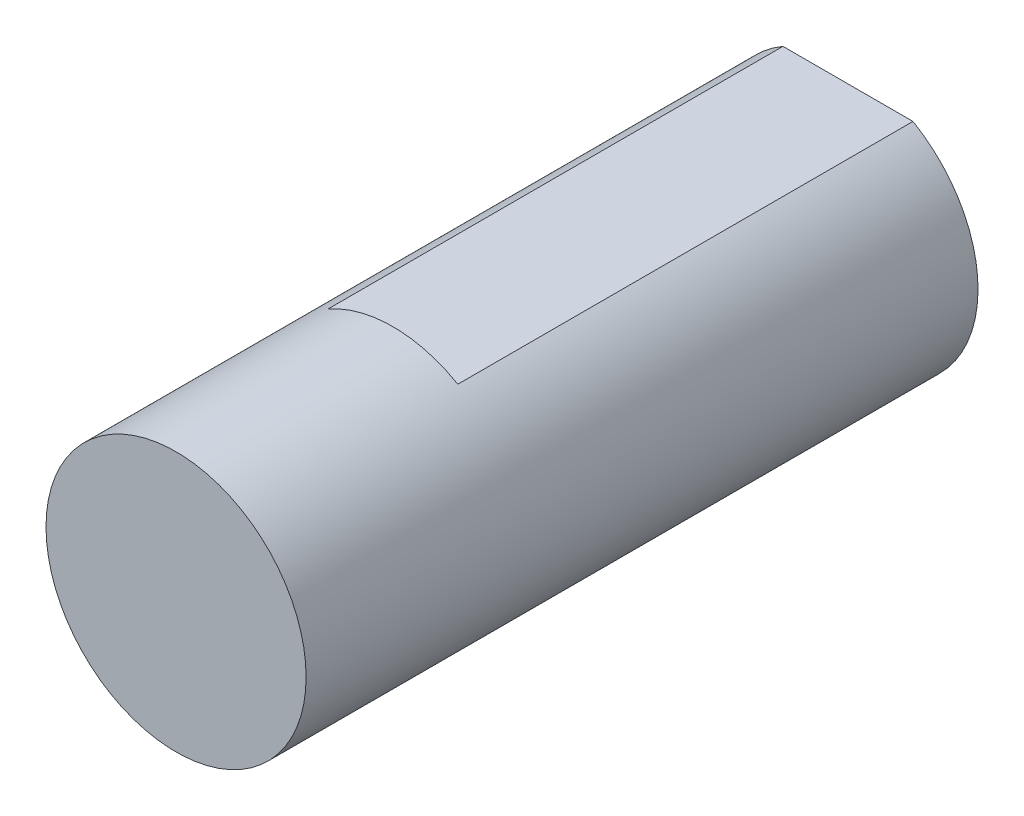
ISO-10303-21;
HEADER;
FILE_DESCRIPTION(('STEP AP214'),'2;1');
FILE_NAME('part.step','',(''),(''),'','','');
FILE_SCHEMA(('AUTOMOTIVE_DESIGN { 1 0 10303 214 1 1 1 1 }'));
ENDSEC;
DATA;
#1=APPLICATION_CONTEXT('core data for automotive mechanical design processes');
#2=APPLICATION_PROTOCOL_DEFINITION('international standard','automotive_design',2000,#1);
#3=PRODUCT_CONTEXT('',#1,'mechanical');
#4=PRODUCT('Part','Part','',(#3));
#5=PRODUCT_RELATED_PRODUCT_CATEGORY('part','',(#4));
#6=PRODUCT_DEFINITION_FORMATION('','',#4);
#7=PRODUCT_DEFINITION_CONTEXT('part definition',#1,'design');
#8=PRODUCT_DEFINITION('design','',#6,#7);
#9=PRODUCT_DEFINITION_SHAPE('','',#8);
#10=(LENGTH_UNIT() NAMED_UNIT(*) SI_UNIT(.MILLI.,.METRE.));
#11=(NAMED_UNIT(*) PLANE_ANGLE_UNIT() SI_UNIT($,.RADIAN.));
#12=(NAMED_UNIT(*) SI_UNIT($,.STERADIAN.) SOLID_ANGLE_UNIT());
#13=UNCERTAINTY_MEASURE_WITH_UNIT(LENGTH_MEASURE(1.E-05),#10,'distance_accuracy_value','');
#14=(GEOMETRIC_REPRESENTATION_CONTEXT(3) GLOBAL_UNCERTAINTY_ASSIGNED_CONTEXT((#13)) GLOBAL_UNIT_ASSIGNED_CONTEXT((#10,
#11,#12)) REPRESENTATION_CONTEXT('',''));
#15=CARTESIAN_POINT('',(0.,0.,0.));
#16=DIRECTION('',(0.,0.,1.));
#17=DIRECTION('',(1.,0.,0.));
#18=AXIS2_PLACEMENT_3D('',#15,#16,#17);
#19=CARTESIAN_POINT('',(0.,0.,31.));
#20=DIRECTION('',(0.,0.,-1.));
#21=DIRECTION('',(-1.,0.,0.));
#22=AXIS2_PLACEMENT_3D('',#19,#20,#21);
#23=CYLINDRICAL_SURFACE('',#22,6.);
#24=CARTESIAN_POINT('',(0.,0.,31.));
#25=DIRECTION('',(0.,0.,1.));
#26=DIRECTION('',(1.,0.,0.));
#27=AXIS2_PLACEMENT_3D('',#24,#25,#26);
#28=CIRCLE('',#27,6.);
#29=CARTESIAN_POINT('',(6.,0.,31.));
#30=VERTEX_POINT('',#29);
#31=EDGE_CURVE('E11',#30,#30,#28,.T.);
#32=ORIENTED_EDGE('',*,*,#31,.F.);
#33=EDGE_LOOP('',(#32));
#34=FACE_BOUND('',#33,.T.);
#35=CARTESIAN_POINT('',(0.,0.,21.));
#36=DIRECTION('',(0.,0.,-1.));
#37=DIRECTION('',(-1.,0.,0.));
#38=AXIS2_PLACEMENT_3D('',#35,#36,#37);
#39=CIRCLE('',#38,6.);
#40=CARTESIAN_POINT('',(-3.,5.19615242270663,21.));
#41=VERTEX_POINT('',#40);
#42=CARTESIAN_POINT('',(3.,5.19615242270663,21.));
#43=VERTEX_POINT('',#42);
#44=EDGE_CURVE('E77',#41,#43,#39,.T.);
#45=ORIENTED_EDGE('',*,*,#44,.F.);
#46=DIRECTION('',(0.,0.,-1.));
#47=VECTOR('',#46,1.);
#48=CARTESIAN_POINT('',(-3.,5.19615242270663,21.));
#49=LINE('',#48,#47);
#50=CARTESIAN_POINT('',(-3.,5.19615242270663,0.));
#51=VERTEX_POINT('',#50);
#52=EDGE_CURVE('E66',#41,#51,#49,.T.);
#53=ORIENTED_EDGE('',*,*,#52,.T.);
#54=CARTESIAN_POINT('',(0.,0.,0.));
#55=DIRECTION('',(0.,0.,1.));
#56=DIRECTION('',(1.,0.,0.));
#57=AXIS2_PLACEMENT_3D('',#54,#55,#56);
#58=CIRCLE('',#57,6.);
#59=CARTESIAN_POINT('',(3.,5.19615242270663,0.));
#60=VERTEX_POINT('',#59);
#61=EDGE_CURVE('E48',#51,#60,#58,.T.);
#62=ORIENTED_EDGE('',*,*,#61,.T.);
#63=DIRECTION('',(0.,0.,-1.));
#64=VECTOR('',#63,1.);
#65=CARTESIAN_POINT('',(3.,5.19615242270663,21.));
#66=LINE('',#65,#64);
#67=EDGE_CURVE('E60',#43,#60,#66,.T.);
#68=ORIENTED_EDGE('',*,*,#67,.F.);
#69=EDGE_LOOP('',(#45,#53,#62,#68));
#70=FACE_BOUND('',#69,.T.);
#71=ADVANCED_FACE('F45',(#34,#70),#23,.T.);
#72=CARTESIAN_POINT('',(0.,0.,31.));
#73=DIRECTION('',(0.,0.,1.));
#74=DIRECTION('',(1.,0.,0.));
#75=AXIS2_PLACEMENT_3D('',#72,#73,#74);
#76=PLANE('',#75);
#77=ORIENTED_EDGE('',*,*,#31,.T.);
#78=EDGE_LOOP('',(#77));
#79=FACE_BOUND('',#78,.T.);
#80=ADVANCED_FACE('F101',(#79),#76,.T.);
#81=CARTESIAN_POINT('',(0.,0.,0.));
#82=DIRECTION('',(0.,0.,1.));
#83=DIRECTION('',(1.,0.,0.));
#84=AXIS2_PLACEMENT_3D('',#81,#82,#83);
#85=PLANE('',#84);
#86=ORIENTED_EDGE('',*,*,#61,.F.);
#87=DIRECTION('',(-1.,0.,0.));
#88=VECTOR('',#87,1.);
#89=CARTESIAN_POINT('',(0.,5.19615242270663,0.));
#90=LINE('',#89,#88);
#91=EDGE_CURVE('E71',#60,#51,#90,.T.);
#92=ORIENTED_EDGE('',*,*,#91,.F.);
#93=EDGE_LOOP('',(#86,#92));
#94=FACE_BOUND('',#93,.T.);
#95=ADVANCED_FACE('F83',(#94),#85,.F.);
#96=CARTESIAN_POINT('',(0.,5.19615242270663,21.));
#97=DIRECTION('',(0.,-1.,0.));
#98=DIRECTION('',(0.,0.,-1.));
#99=AXIS2_PLACEMENT_3D('',#96,#97,#98);
#100=PLANE('',#99);
#101=ORIENTED_EDGE('',*,*,#91,.T.);
#102=ORIENTED_EDGE('',*,*,#52,.F.);
#103=DIRECTION('',(-1.,0.,0.));
#104=VECTOR('',#103,1.);
#105=CARTESIAN_POINT('',(0.,5.19615242270663,21.));
#106=LINE('',#105,#104);
#107=EDGE_CURVE('E87',#43,#41,#106,.T.);
#108=ORIENTED_EDGE('',*,*,#107,.F.);
#109=ORIENTED_EDGE('',*,*,#67,.T.);
#110=EDGE_LOOP('',(#101,#102,#108,#109));
#111=FACE_BOUND('',#110,.T.);
#112=ADVANCED_FACE('F72',(#111),#100,.F.);
#113=CARTESIAN_POINT('',(0.,0.,21.));
#114=DIRECTION('',(0.,0.,-1.));
#115=DIRECTION('',(-1.,0.,0.));
#116=AXIS2_PLACEMENT_3D('',#113,#114,#115);
#117=PLANE('',#116);
#118=ORIENTED_EDGE('',*,*,#44,.T.);
#119=ORIENTED_EDGE('',*,*,#107,.T.);
#120=EDGE_LOOP('',(#118,#119));
#121=FACE_BOUND('',#120,.T.);
#122=ADVANCED_FACE('F93',(#121),#117,.T.);
#123=CLOSED_SHELL('',(#71,#80,#95,#112,#122));
#124=MANIFOLD_SOLID_BREP('B2',#123);
#125=ADVANCED_BREP_SHAPE_REPRESENTATION('',(#18,#124),#14);
#126=SHAPE_DEFINITION_REPRESENTATION(#9,#125);
ENDSEC;
END-ISO-10303-21;
